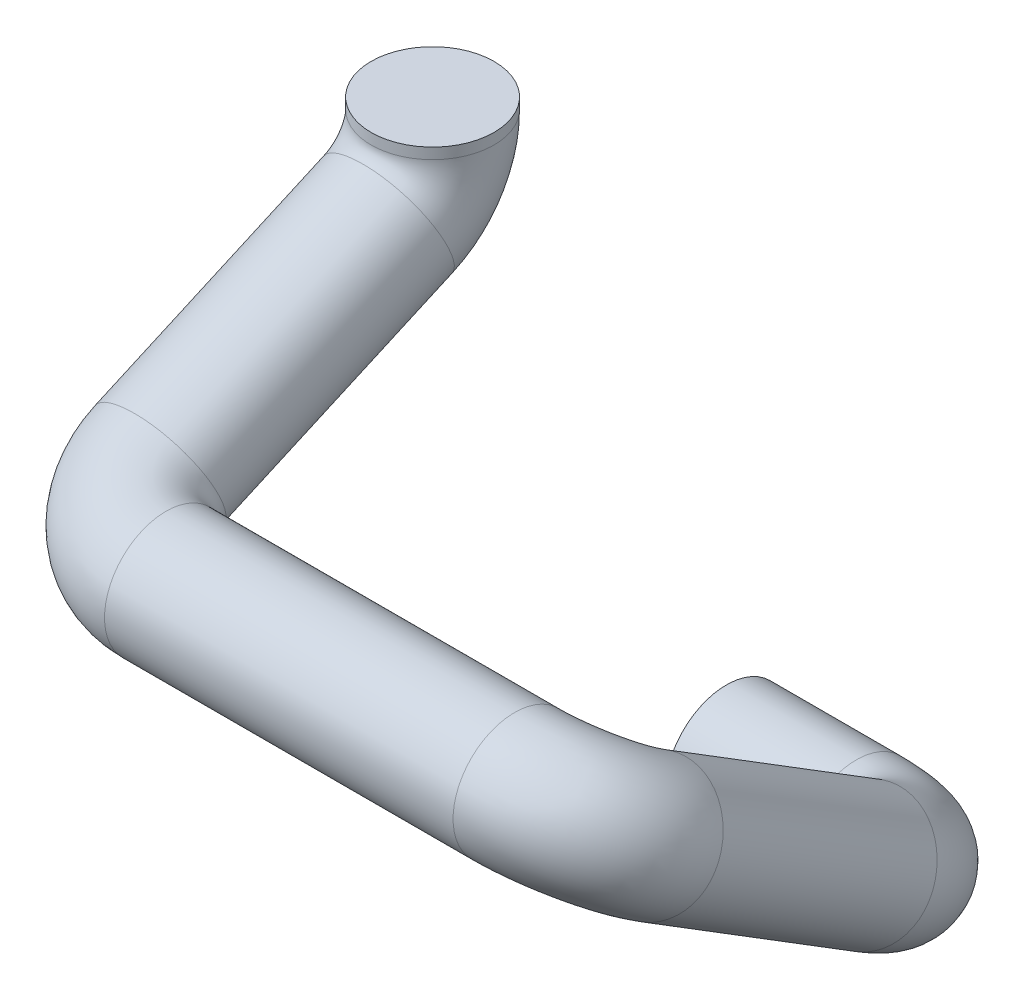
ISO-10303-21;
HEADER;
FILE_DESCRIPTION(('STEP AP214'),'2;1');
FILE_NAME('part.step','',(''),(''),'','','');
FILE_SCHEMA(('AUTOMOTIVE_DESIGN { 1 0 10303 214 1 1 1 1 }'));
ENDSEC;
DATA;
#1=APPLICATION_CONTEXT('core data for automotive mechanical design processes');
#2=APPLICATION_PROTOCOL_DEFINITION('international standard','automotive_design',2000,#1);
#3=PRODUCT_CONTEXT('',#1,'mechanical');
#4=PRODUCT('Part','Part','',(#3));
#5=PRODUCT_RELATED_PRODUCT_CATEGORY('part','',(#4));
#6=PRODUCT_DEFINITION_FORMATION('','',#4);
#7=PRODUCT_DEFINITION_CONTEXT('part definition',#1,'design');
#8=PRODUCT_DEFINITION('design','',#6,#7);
#9=PRODUCT_DEFINITION_SHAPE('','',#8);
#10=(LENGTH_UNIT() NAMED_UNIT(*) SI_UNIT(.MILLI.,.METRE.));
#11=(NAMED_UNIT(*) PLANE_ANGLE_UNIT() SI_UNIT($,.RADIAN.));
#12=(NAMED_UNIT(*) SI_UNIT($,.STERADIAN.) SOLID_ANGLE_UNIT());
#13=UNCERTAINTY_MEASURE_WITH_UNIT(LENGTH_MEASURE(1.E-05),#10,'distance_accuracy_value','');
#14=(GEOMETRIC_REPRESENTATION_CONTEXT(3) GLOBAL_UNCERTAINTY_ASSIGNED_CONTEXT((#13)) GLOBAL_UNIT_ASSIGNED_CONTEXT((#10,
#11,#12)) REPRESENTATION_CONTEXT('',''));
#15=CARTESIAN_POINT('',(0.,0.,0.));
#16=DIRECTION('',(0.,0.,1.));
#17=DIRECTION('',(1.,0.,0.));
#18=AXIS2_PLACEMENT_3D('',#15,#16,#17);
#19=CARTESIAN_POINT('',(0.,62.,0.));
#20=DIRECTION('',(0.,1.,0.));
#21=DIRECTION('',(0.,0.,1.));
#22=AXIS2_PLACEMENT_3D('',#19,#20,#21);
#23=PLANE('',#22);
#24=CARTESIAN_POINT('',(0.,62.,0.));
#25=DIRECTION('',(0.,1.,0.));
#26=DIRECTION('',(0.,0.,1.));
#27=AXIS2_PLACEMENT_3D('',#24,#25,#26);
#28=CIRCLE('',#27,9.);
#29=CARTESIAN_POINT('',(0.,62.,9.));
#30=VERTEX_POINT('',#29);
#31=EDGE_CURVE('E65',#30,#30,#28,.T.);
#32=ORIENTED_EDGE('',*,*,#31,.T.);
#33=EDGE_LOOP('',(#32));
#34=FACE_BOUND('',#33,.T.);
#35=ADVANCED_FACE('F31',(#34),#23,.T.);
#36=CARTESIAN_POINT('',(43.,0.,0.));
#37=DIRECTION('',(1.,0.,0.));
#38=DIRECTION('',(0.,0.041913570002018,-0.999121240215464));
#39=AXIS2_PLACEMENT_3D('',#36,#37,#38);
#40=PLANE('',#39);
#41=CARTESIAN_POINT('',(43.,0.,0.));
#42=DIRECTION('',(1.,0.,0.));
#43=DIRECTION('',(0.,0.041913570002018,-0.999121240215464));
#44=AXIS2_PLACEMENT_3D('',#41,#42,#43);
#45=CIRCLE('',#44,9.);
#46=CARTESIAN_POINT('',(43.,0.377222130018162,-8.99209116193917));
#47=VERTEX_POINT('',#46);
#48=EDGE_CURVE('E10',#47,#47,#45,.T.);
#49=ORIENTED_EDGE('',*,*,#48,.F.);
#50=EDGE_LOOP('',(#49));
#51=FACE_BOUND('',#50,.T.);
#52=ADVANCED_FACE('F73',(#51),#40,.F.);
#53=CARTESIAN_POINT('',(0.,62.,0.));
#54=DIRECTION('',(0.,-1.,0.));
#55=DIRECTION('',(0.,0.,-1.));
#56=AXIS2_PLACEMENT_3D('',#53,#54,#55);
#57=CYLINDRICAL_SURFACE('',#56,9.);
#58=CARTESIAN_POINT('',(0.,60.4049177905995,0.));
#59=DIRECTION('',(0.,1.,0.));
#60=DIRECTION('',(0.,0.,1.));
#61=AXIS2_PLACEMENT_3D('',#58,#59,#60);
#62=CIRCLE('',#61,9.);
#63=CARTESIAN_POINT('',(0.,60.4049177905995,-9.00000000000007));
#64=VERTEX_POINT('',#63);
#65=EDGE_CURVE('E62',#64,#64,#62,.T.);
#66=ORIENTED_EDGE('',*,*,#65,.T.);
#67=EDGE_LOOP('',(#66));
#68=FACE_BOUND('',#67,.T.);
#69=ORIENTED_EDGE('',*,*,#31,.F.);
#70=EDGE_LOOP('',(#69));
#71=FACE_BOUND('',#70,.T.);
#72=ADVANCED_FACE('F70',(#68,#71),#57,.T.);
#73=CARTESIAN_POINT('',(0.,60.4049177905995,11.));
#74=DIRECTION('',(-1.,0.,0.));
#75=DIRECTION('',(0.,0.,1.));
#76=AXIS2_PLACEMENT_3D('',#73,#74,#75);
#77=TOROIDAL_SURFACE('',#76,11.0000000000001,9.);
#78=CARTESIAN_POINT('',(0.,50.3559177565309,6.5258969261662));
#79=DIRECTION('',(0.,0.406736643075801,-0.913545457642601));
#80=DIRECTION('',(0.,0.913545457642601,0.406736643075801));
#81=AXIS2_PLACEMENT_3D('',#78,#79,#80);
#82=CIRCLE('',#81,9.);
#83=CARTESIAN_POINT('',(0.,42.1340086377474,2.86526713848396));
#84=VERTEX_POINT('',#83);
#85=EDGE_CURVE('E59',#84,#84,#82,.T.);
#86=CARTESIAN_POINT('',(0.,60.4049177905995,11.));
#87=DIRECTION('',(-1.,0.,0.));
#88=DIRECTION('',(0.,0.,1.));
#89=AXIS2_PLACEMENT_3D('',#86,#87,#88);
#90=CIRCLE('',#89,20.0000000000001);
#91=EDGE_CURVE('',#64,#84,#90,.T.);
#92=ORIENTED_EDGE('',*,*,#65,.F.);
#93=ORIENTED_EDGE('',*,*,#85,.T.);
#94=ORIENTED_EDGE('',*,*,#91,.T.);
#95=ORIENTED_EDGE('',*,*,#91,.F.);
#96=EDGE_LOOP('',(#92,#94,#93,#95));
#97=FACE_BOUND('',#96,.T.);
#98=ADVANCED_FACE('F72',(#97),#77,.T.);
#99=CARTESIAN_POINT('',(0.,50.3559177565309,6.52589692616619));
#100=DIRECTION('',(0.,-0.406736643075801,0.913545457642601));
#101=DIRECTION('',(0.,-0.913545457642601,-0.406736643075801));
#102=AXIS2_PLACEMENT_3D('',#99,#100,#101);
#103=CYLINDRICAL_SURFACE('',#102,9.);
#104=CARTESIAN_POINT('',(0.,35.4741030738338,39.9509999659314));
#105=DIRECTION('',(0.,0.406736643075801,-0.913545457642601));
#106=DIRECTION('',(0.,0.913545457642601,0.406736643075801));
#107=AXIS2_PLACEMENT_3D('',#104,#105,#106);
#108=CIRCLE('',#107,9.);
#109=CARTESIAN_POINT('',(-9.00000000000001,35.4741030738338,39.9509999659314));
#110=VERTEX_POINT('',#109);
#111=EDGE_CURVE('E56',#110,#110,#108,.T.);
#112=ORIENTED_EDGE('',*,*,#111,.T.);
#113=EDGE_LOOP('',(#112));
#114=FACE_BOUND('',#113,.T.);
#115=ORIENTED_EDGE('',*,*,#85,.F.);
#116=EDGE_LOOP('',(#115));
#117=FACE_BOUND('',#116,.T.);
#118=ADVANCED_FACE('F80',(#114,#117),#103,.T.);
#119=CARTESIAN_POINT('',(11.,35.4741030738338,39.9509999659314));
#120=DIRECTION('',(0.,0.913545457642601,0.406736643075799));
#121=DIRECTION('',(0.,-0.406736643075799,0.913545457642601));
#122=AXIS2_PLACEMENT_3D('',#119,#120,#121);
#123=TOROIDAL_SURFACE('',#122,11.,9.);
#124=CARTESIAN_POINT('',(11.,31.,50.));
#125=DIRECTION('',(-1.,0.,0.));
#126=DIRECTION('',(0.,0.913545457642601,0.406736643075799));
#127=AXIS2_PLACEMENT_3D('',#124,#125,#126);
#128=CIRCLE('',#127,9.);
#129=CARTESIAN_POINT('',(11.,27.3393702123178,58.2219091187834));
#130=VERTEX_POINT('',#129);
#131=EDGE_CURVE('E53',#130,#130,#128,.T.);
#132=CARTESIAN_POINT('',(11.,35.4741030738338,39.9509999659314));
#133=DIRECTION('',(0.,0.913545457642601,0.406736643075799));
#134=DIRECTION('',(0.,-0.406736643075799,0.913545457642601));
#135=AXIS2_PLACEMENT_3D('',#132,#133,#134);
#136=CIRCLE('',#135,20.);
#137=EDGE_CURVE('',#110,#130,#136,.T.);
#138=ORIENTED_EDGE('',*,*,#111,.F.);
#139=ORIENTED_EDGE('',*,*,#131,.T.);
#140=ORIENTED_EDGE('',*,*,#137,.T.);
#141=ORIENTED_EDGE('',*,*,#137,.F.);
#142=EDGE_LOOP('',(#138,#140,#139,#141));
#143=FACE_BOUND('',#142,.T.);
#144=ADVANCED_FACE('F105',(#143),#123,.T.);
#145=CARTESIAN_POINT('',(11.,31.,50.));
#146=DIRECTION('',(1.,0.,0.));
#147=DIRECTION('',(0.,1.,0.));
#148=AXIS2_PLACEMENT_3D('',#145,#146,#147);
#149=CYLINDRICAL_SURFACE('',#148,9.);
#150=CARTESIAN_POINT('',(62.,31.,50.));
#151=DIRECTION('',(-1.,0.,0.));
#152=DIRECTION('',(0.,0.913545457642601,0.406736643075799));
#153=AXIS2_PLACEMENT_3D('',#150,#151,#152);
#154=CIRCLE('',#153,9.);
#155=CARTESIAN_POINT('',(62.,35.7424570197551,57.6491242254114));
#156=VERTEX_POINT('',#155);
#157=EDGE_CURVE('E50',#156,#156,#154,.T.);
#158=ORIENTED_EDGE('',*,*,#157,.T.);
#159=EDGE_LOOP('',(#158));
#160=FACE_BOUND('',#159,.T.);
#161=ORIENTED_EDGE('',*,*,#131,.F.);
#162=EDGE_LOOP('',(#161));
#163=FACE_BOUND('',#162,.T.);
#164=ADVANCED_FACE('F101',(#160,#163),#149,.T.);
#165=CARTESIAN_POINT('',(62.,25.2036636425216,40.6510703911638));
#166=DIRECTION('',(0.,0.849902691712379,-0.526939668861675));
#167=DIRECTION('',(0.,0.526939668861675,0.849902691712379));
#168=AXIS2_PLACEMENT_3D('',#165,#166,#167);
#169=TOROIDAL_SURFACE('',#168,11.,9.);
#170=CARTESIAN_POINT('',(73.,25.2036636425216,40.6510703911638));
#171=DIRECTION('',(0.,0.526939668861675,0.84990269171238));
#172=DIRECTION('',(0.827069908708459,0.47772951382231,-0.296192298569831));
#173=AXIS2_PLACEMENT_3D('',#170,#171,#172);
#174=CIRCLE('',#173,9.);
#175=CARTESIAN_POINT('',(82.,25.2036636425216,40.6510703911638));
#176=VERTEX_POINT('',#175);
#177=EDGE_CURVE('E45',#176,#176,#174,.T.);
#178=CARTESIAN_POINT('',(62.,25.2036636425216,40.6510703911638));
#179=DIRECTION('',(0.,0.849902691712379,-0.526939668861675));
#180=DIRECTION('',(0.,0.526939668861675,0.849902691712379));
#181=AXIS2_PLACEMENT_3D('',#178,#179,#180);
#182=CIRCLE('',#181,20.);
#183=EDGE_CURVE('',#156,#176,#182,.T.);
#184=ORIENTED_EDGE('',*,*,#157,.F.);
#185=ORIENTED_EDGE('',*,*,#177,.T.);
#186=ORIENTED_EDGE('',*,*,#183,.T.);
#187=ORIENTED_EDGE('',*,*,#183,.F.);
#188=EDGE_LOOP('',(#184,#186,#185,#187));
#189=FACE_BOUND('',#188,.T.);
#190=ADVANCED_FACE('F97',(#189),#169,.T.);
#191=CARTESIAN_POINT('',(73.,25.2036636425216,40.6510703911638));
#192=DIRECTION('',(0.,-0.526939668861675,-0.849902691712379));
#193=DIRECTION('',(0.,0.84990269171238,-0.526939668861675));
#194=AXIS2_PLACEMENT_3D('',#191,#192,#193);
#195=CYLINDRICAL_SURFACE('',#194,9.);
#196=CARTESIAN_POINT('',(73.,5.79633635747843,9.34892960883618));
#197=DIRECTION('',(0.,0.526939668861675,0.84990269171238));
#198=DIRECTION('',(0.827069908708459,0.47772951382231,-0.296192298569832));
#199=AXIS2_PLACEMENT_3D('',#196,#197,#198);
#200=CIRCLE('',#199,9.);
#201=CARTESIAN_POINT('',(82.,5.79633635747843,9.34892960883619));
#202=VERTEX_POINT('',#201);
#203=EDGE_CURVE('E41',#202,#202,#200,.T.);
#204=ORIENTED_EDGE('',*,*,#203,.T.);
#205=EDGE_LOOP('',(#204));
#206=FACE_BOUND('',#205,.T.);
#207=ORIENTED_EDGE('',*,*,#177,.F.);
#208=EDGE_LOOP('',(#207));
#209=FACE_BOUND('',#208,.T.);
#210=ADVANCED_FACE('F91',(#206,#209),#195,.T.);
#211=CARTESIAN_POINT('',(62.,5.79633635747843,9.34892960883617));
#212=DIRECTION('',(0.,0.849902691712379,-0.526939668861676));
#213=DIRECTION('',(0.,0.526939668861676,0.849902691712379));
#214=AXIS2_PLACEMENT_3D('',#211,#212,#213);
#215=TOROIDAL_SURFACE('',#214,11.,9.);
#216=CARTESIAN_POINT('',(62.,0.,0.));
#217=DIRECTION('',(1.,0.,0.));
#218=DIRECTION('',(0.,0.041913570002018,-0.999121240215464));
#219=AXIS2_PLACEMENT_3D('',#216,#217,#218);
#220=CIRCLE('',#219,9.);
#221=CARTESIAN_POINT('',(62.,-4.74245701975509,-7.64912422541141));
#222=VERTEX_POINT('',#221);
#223=EDGE_CURVE('E37',#222,#222,#220,.T.);
#224=CARTESIAN_POINT('',(62.,5.79633635747843,9.34892960883617));
#225=DIRECTION('',(0.,0.849902691712379,-0.526939668861676));
#226=DIRECTION('',(0.,0.526939668861676,0.849902691712379));
#227=AXIS2_PLACEMENT_3D('',#224,#225,#226);
#228=CIRCLE('',#227,20.);
#229=EDGE_CURVE('',#202,#222,#228,.T.);
#230=ORIENTED_EDGE('',*,*,#203,.F.);
#231=ORIENTED_EDGE('',*,*,#223,.T.);
#232=ORIENTED_EDGE('',*,*,#229,.T.);
#233=ORIENTED_EDGE('',*,*,#229,.F.);
#234=EDGE_LOOP('',(#230,#232,#231,#233));
#235=FACE_BOUND('',#234,.T.);
#236=ADVANCED_FACE('F86',(#235),#215,.T.);
#237=CARTESIAN_POINT('',(62.,0.,0.));
#238=DIRECTION('',(-1.,0.,0.));
#239=DIRECTION('',(0.,0.,1.));
#240=AXIS2_PLACEMENT_3D('',#237,#238,#239);
#241=CYLINDRICAL_SURFACE('',#240,9.);
#242=ORIENTED_EDGE('',*,*,#48,.T.);
#243=EDGE_LOOP('',(#242));
#244=FACE_BOUND('',#243,.T.);
#245=ORIENTED_EDGE('',*,*,#223,.F.);
#246=EDGE_LOOP('',(#245));
#247=FACE_BOUND('',#246,.T.);
#248=ADVANCED_FACE('F84',(#244,#247),#241,.T.);
#249=CLOSED_SHELL('',(#35,#52,#72,#98,#118,#144,#164,#190,#210,#236,#248));
#250=MANIFOLD_SOLID_BREP('B2',#249);
#251=ADVANCED_BREP_SHAPE_REPRESENTATION('',(#18,#250),#14);
#252=SHAPE_DEFINITION_REPRESENTATION(#9,#251);
ENDSEC;
END-ISO-10303-21;
